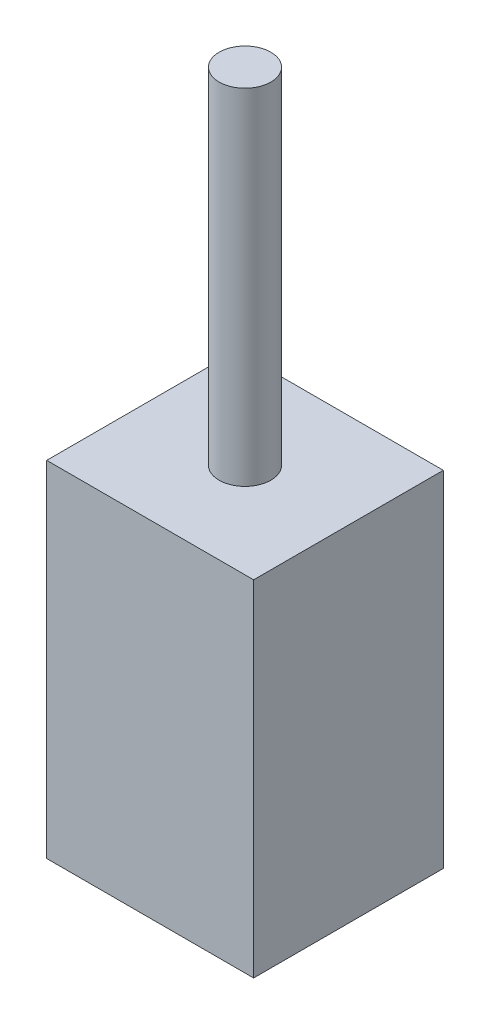
ISO-10303-21;
HEADER;
FILE_DESCRIPTION(('STEP AP214'),'2;1');
FILE_NAME('part.step','',(''),(''),'','','');
FILE_SCHEMA(('AUTOMOTIVE_DESIGN { 1 0 10303 214 1 1 1 1 }'));
ENDSEC;
DATA;
#1=APPLICATION_CONTEXT('core data for automotive mechanical design processes');
#2=APPLICATION_PROTOCOL_DEFINITION('international standard','automotive_design',2000,#1);
#3=PRODUCT_CONTEXT('',#1,'mechanical');
#4=PRODUCT('Part','Part','',(#3));
#5=PRODUCT_RELATED_PRODUCT_CATEGORY('part','',(#4));
#6=PRODUCT_DEFINITION_FORMATION('','',#4);
#7=PRODUCT_DEFINITION_CONTEXT('part definition',#1,'design');
#8=PRODUCT_DEFINITION('design','',#6,#7);
#9=PRODUCT_DEFINITION_SHAPE('','',#8);
#10=(LENGTH_UNIT() NAMED_UNIT(*) SI_UNIT(.MILLI.,.METRE.));
#11=(NAMED_UNIT(*) PLANE_ANGLE_UNIT() SI_UNIT($,.RADIAN.));
#12=(NAMED_UNIT(*) SI_UNIT($,.STERADIAN.) SOLID_ANGLE_UNIT());
#13=UNCERTAINTY_MEASURE_WITH_UNIT(LENGTH_MEASURE(1.E-05),#10,'distance_accuracy_value','');
#14=(GEOMETRIC_REPRESENTATION_CONTEXT(3) GLOBAL_UNCERTAINTY_ASSIGNED_CONTEXT((#13)) GLOBAL_UNIT_ASSIGNED_CONTEXT((#10,
#11,#12)) REPRESENTATION_CONTEXT('',''));
#15=CARTESIAN_POINT('',(0.,0.,0.));
#16=DIRECTION('',(0.,0.,1.));
#17=DIRECTION('',(1.,0.,0.));
#18=AXIS2_PLACEMENT_3D('',#15,#16,#17);
#19=CARTESIAN_POINT('',(0.,20.,0.));
#20=DIRECTION('',(1.,0.,0.));
#21=DIRECTION('',(0.,0.,-1.));
#22=AXIS2_PLACEMENT_3D('',#19,#20,#21);
#23=PLANE('',#22);
#24=DIRECTION('',(0.,0.,1.));
#25=VECTOR('',#24,1.);
#26=CARTESIAN_POINT('',(0.,0.,0.));
#27=LINE('',#26,#25);
#28=CARTESIAN_POINT('',(0.,0.,-11.));
#29=VERTEX_POINT('',#28);
#30=CARTESIAN_POINT('',(0.,0.,0.));
#31=VERTEX_POINT('',#30);
#32=EDGE_CURVE('E103',#29,#31,#27,.T.);
#33=ORIENTED_EDGE('',*,*,#32,.T.);
#34=DIRECTION('',(0.,-1.,0.));
#35=VECTOR('',#34,1.);
#36=CARTESIAN_POINT('',(0.,20.,0.));
#37=LINE('',#36,#35);
#38=CARTESIAN_POINT('',(0.,20.,0.));
#39=VERTEX_POINT('',#38);
#40=EDGE_CURVE('E40',#39,#31,#37,.T.);
#41=ORIENTED_EDGE('',*,*,#40,.F.);
#42=DIRECTION('',(0.,0.,1.));
#43=VECTOR('',#42,1.);
#44=CARTESIAN_POINT('',(0.,20.,0.));
#45=LINE('',#44,#43);
#46=CARTESIAN_POINT('',(0.,20.,-11.));
#47=VERTEX_POINT('',#46);
#48=EDGE_CURVE('E90',#47,#39,#45,.T.);
#49=ORIENTED_EDGE('',*,*,#48,.F.);
#50=DIRECTION('',(0.,-1.,0.));
#51=VECTOR('',#50,1.);
#52=CARTESIAN_POINT('',(0.,20.,-11.));
#53=LINE('',#52,#51);
#54=EDGE_CURVE('E99',#47,#29,#53,.T.);
#55=ORIENTED_EDGE('',*,*,#54,.T.);
#56=EDGE_LOOP('',(#33,#41,#49,#55));
#57=FACE_BOUND('',#56,.T.);
#58=ADVANCED_FACE('F37',(#57),#23,.F.);
#59=CARTESIAN_POINT('',(0.,20.,0.));
#60=DIRECTION('',(0.,0.,-1.));
#61=DIRECTION('',(-1.,0.,0.));
#62=AXIS2_PLACEMENT_3D('',#59,#60,#61);
#63=PLANE('',#62);
#64=DIRECTION('',(1.,0.,0.));
#65=VECTOR('',#64,1.);
#66=CARTESIAN_POINT('',(0.,0.,0.));
#67=LINE('',#66,#65);
#68=CARTESIAN_POINT('',(12.,0.,0.));
#69=VERTEX_POINT('',#68);
#70=EDGE_CURVE('E95',#31,#69,#67,.T.);
#71=ORIENTED_EDGE('',*,*,#70,.T.);
#72=DIRECTION('',(0.,-1.,0.));
#73=VECTOR('',#72,1.);
#74=CARTESIAN_POINT('',(12.,20.,0.));
#75=LINE('',#74,#73);
#76=CARTESIAN_POINT('',(12.,20.,0.));
#77=VERTEX_POINT('',#76);
#78=EDGE_CURVE('E93',#77,#69,#75,.T.);
#79=ORIENTED_EDGE('',*,*,#78,.F.);
#80=DIRECTION('',(1.,0.,0.));
#81=VECTOR('',#80,1.);
#82=CARTESIAN_POINT('',(0.,20.,0.));
#83=LINE('',#82,#81);
#84=EDGE_CURVE('E85',#39,#77,#83,.T.);
#85=ORIENTED_EDGE('',*,*,#84,.F.);
#86=ORIENTED_EDGE('',*,*,#40,.T.);
#87=EDGE_LOOP('',(#71,#79,#85,#86));
#88=FACE_BOUND('',#87,.T.);
#89=ADVANCED_FACE('F94',(#88),#63,.F.);
#90=CARTESIAN_POINT('',(12.,20.,0.));
#91=DIRECTION('',(-1.,0.,0.));
#92=DIRECTION('',(0.,0.,1.));
#93=AXIS2_PLACEMENT_3D('',#90,#91,#92);
#94=PLANE('',#93);
#95=DIRECTION('',(0.,0.,-1.));
#96=VECTOR('',#95,1.);
#97=CARTESIAN_POINT('',(12.,0.,0.));
#98=LINE('',#97,#96);
#99=CARTESIAN_POINT('',(12.,0.,-11.));
#100=VERTEX_POINT('',#99);
#101=EDGE_CURVE('E71',#69,#100,#98,.T.);
#102=ORIENTED_EDGE('',*,*,#101,.T.);
#103=DIRECTION('',(0.,-1.,0.));
#104=VECTOR('',#103,1.);
#105=CARTESIAN_POINT('',(12.,20.,-11.));
#106=LINE('',#105,#104);
#107=CARTESIAN_POINT('',(12.,20.,-11.));
#108=VERTEX_POINT('',#107);
#109=EDGE_CURVE('E96',#108,#100,#106,.T.);
#110=ORIENTED_EDGE('',*,*,#109,.F.);
#111=DIRECTION('',(0.,0.,-1.));
#112=VECTOR('',#111,1.);
#113=CARTESIAN_POINT('',(12.,20.,0.));
#114=LINE('',#113,#112);
#115=EDGE_CURVE('E88',#77,#108,#114,.T.);
#116=ORIENTED_EDGE('',*,*,#115,.F.);
#117=ORIENTED_EDGE('',*,*,#78,.T.);
#118=EDGE_LOOP('',(#102,#110,#116,#117));
#119=FACE_BOUND('',#118,.T.);
#120=ADVANCED_FACE('F97',(#119),#94,.F.);
#121=CARTESIAN_POINT('',(0.,20.,-11.));
#122=DIRECTION('',(0.,0.,1.));
#123=DIRECTION('',(1.,0.,0.));
#124=AXIS2_PLACEMENT_3D('',#121,#122,#123);
#125=PLANE('',#124);
#126=DIRECTION('',(-1.,0.,0.));
#127=VECTOR('',#126,1.);
#128=CARTESIAN_POINT('',(0.,0.,-11.));
#129=LINE('',#128,#127);
#130=EDGE_CURVE('E77',#100,#29,#129,.T.);
#131=ORIENTED_EDGE('',*,*,#130,.T.);
#132=ORIENTED_EDGE('',*,*,#54,.F.);
#133=DIRECTION('',(-1.,0.,0.));
#134=VECTOR('',#133,1.);
#135=CARTESIAN_POINT('',(0.,20.,-11.));
#136=LINE('',#135,#134);
#137=EDGE_CURVE('E54',#108,#47,#136,.T.);
#138=ORIENTED_EDGE('',*,*,#137,.F.);
#139=ORIENTED_EDGE('',*,*,#109,.T.);
#140=EDGE_LOOP('',(#131,#132,#138,#139));
#141=FACE_BOUND('',#140,.T.);
#142=ADVANCED_FACE('F111',(#141),#125,.F.);
#143=CARTESIAN_POINT('',(0.,20.,0.));
#144=DIRECTION('',(0.,-1.,0.));
#145=DIRECTION('',(0.,0.,-1.));
#146=AXIS2_PLACEMENT_3D('',#143,#144,#145);
#147=PLANE('',#146);
#148=CARTESIAN_POINT('',(6.,20.,-5.5));
#149=DIRECTION('',(0.,1.,0.));
#150=DIRECTION('',(0.,0.,1.));
#151=AXIS2_PLACEMENT_3D('',#148,#149,#150);
#152=CIRCLE('',#151,1.5);
#153=CARTESIAN_POINT('',(6.,20.,-4.));
#154=VERTEX_POINT('',#153);
#155=EDGE_CURVE('E11',#154,#154,#152,.T.);
#156=ORIENTED_EDGE('',*,*,#155,.F.);
#157=EDGE_LOOP('',(#156));
#158=FACE_BOUND('',#157,.T.);
#159=ORIENTED_EDGE('',*,*,#48,.T.);
#160=ORIENTED_EDGE('',*,*,#84,.T.);
#161=ORIENTED_EDGE('',*,*,#115,.T.);
#162=ORIENTED_EDGE('',*,*,#137,.T.);
#163=EDGE_LOOP('',(#159,#160,#161,#162));
#164=FACE_BOUND('',#163,.T.);
#165=ADVANCED_FACE('F86',(#158,#164),#147,.F.);
#166=CARTESIAN_POINT('',(0.,0.,0.));
#167=DIRECTION('',(0.,-1.,0.));
#168=DIRECTION('',(0.,0.,-1.));
#169=AXIS2_PLACEMENT_3D('',#166,#167,#168);
#170=PLANE('',#169);
#171=ORIENTED_EDGE('',*,*,#32,.F.);
#172=ORIENTED_EDGE('',*,*,#130,.F.);
#173=ORIENTED_EDGE('',*,*,#101,.F.);
#174=ORIENTED_EDGE('',*,*,#70,.F.);
#175=EDGE_LOOP('',(#171,#172,#173,#174));
#176=FACE_BOUND('',#175,.T.);
#177=ADVANCED_FACE('F114',(#176),#170,.T.);
#178=CARTESIAN_POINT('',(6.,40.,-5.5));
#179=DIRECTION('',(0.,-1.,0.));
#180=DIRECTION('',(0.,0.,-1.));
#181=AXIS2_PLACEMENT_3D('',#178,#179,#180);
#182=CYLINDRICAL_SURFACE('',#181,1.5);
#183=CARTESIAN_POINT('',(6.,40.,-5.5));
#184=DIRECTION('',(0.,1.,0.));
#185=DIRECTION('',(0.,0.,1.));
#186=AXIS2_PLACEMENT_3D('',#183,#184,#185);
#187=CIRCLE('',#186,1.5);
#188=CARTESIAN_POINT('',(6.,40.,-4.));
#189=VERTEX_POINT('',#188);
#190=EDGE_CURVE('E106',#189,#189,#187,.T.);
#191=ORIENTED_EDGE('',*,*,#190,.F.);
#192=EDGE_LOOP('',(#191));
#193=FACE_BOUND('',#192,.T.);
#194=ORIENTED_EDGE('',*,*,#155,.T.);
#195=EDGE_LOOP('',(#194));
#196=FACE_BOUND('',#195,.T.);
#197=ADVANCED_FACE('F122',(#193,#196),#182,.T.);
#198=CARTESIAN_POINT('',(6.,40.,-5.5));
#199=DIRECTION('',(0.,1.,0.));
#200=DIRECTION('',(0.,0.,1.));
#201=AXIS2_PLACEMENT_3D('',#198,#199,#200);
#202=PLANE('',#201);
#203=ORIENTED_EDGE('',*,*,#190,.T.);
#204=EDGE_LOOP('',(#203));
#205=FACE_BOUND('',#204,.T.);
#206=ADVANCED_FACE('F120',(#205),#202,.T.);
#207=CLOSED_SHELL('',(#58,#89,#120,#142,#165,#177,#197,#206));
#208=MANIFOLD_SOLID_BREP('B2',#207);
#209=ADVANCED_BREP_SHAPE_REPRESENTATION('',(#18,#208),#14);
#210=SHAPE_DEFINITION_REPRESENTATION(#9,#209);
ENDSEC;
END-ISO-10303-21;
